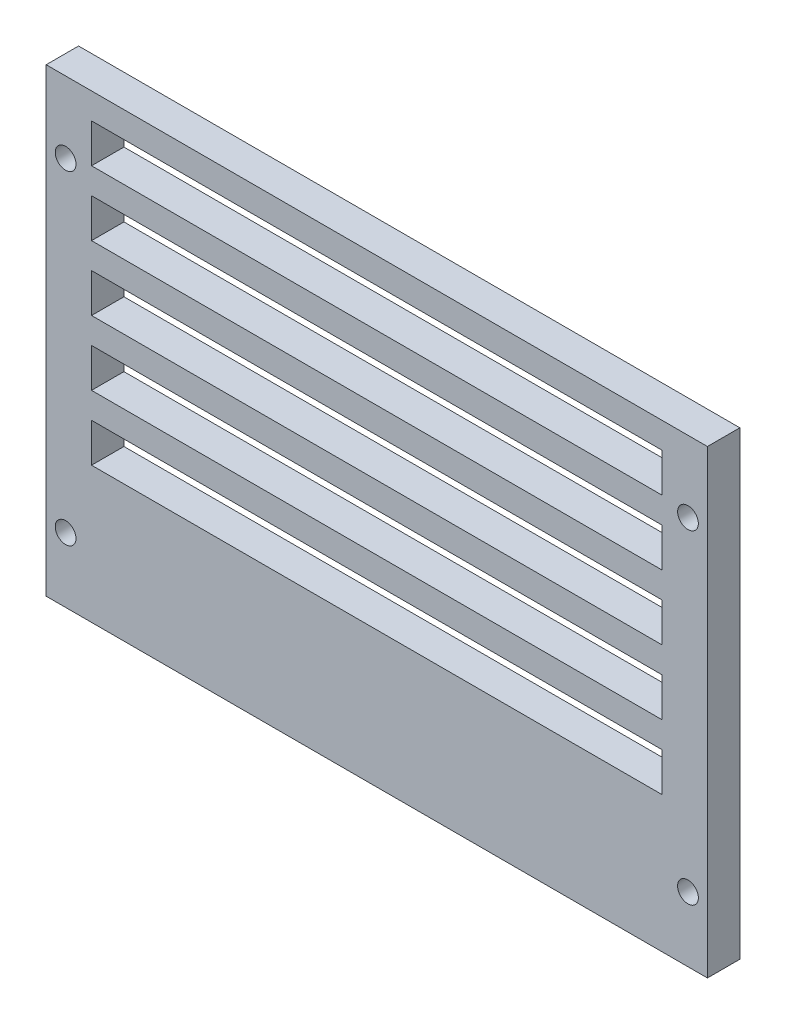
ISO-10303-21;
HEADER;
FILE_DESCRIPTION(('STEP AP214'),'2;1');
FILE_NAME('part.step','',(''),(''),'','','');
FILE_SCHEMA(('AUTOMOTIVE_DESIGN { 1 0 10303 214 1 1 1 1 }'));
ENDSEC;
DATA;
#1=APPLICATION_CONTEXT('core data for automotive mechanical design processes');
#2=APPLICATION_PROTOCOL_DEFINITION('international standard','automotive_design',2000,#1);
#3=PRODUCT_CONTEXT('',#1,'mechanical');
#4=PRODUCT('Part','Part','',(#3));
#5=PRODUCT_RELATED_PRODUCT_CATEGORY('part','',(#4));
#6=PRODUCT_DEFINITION_FORMATION('','',#4);
#7=PRODUCT_DEFINITION_CONTEXT('part definition',#1,'design');
#8=PRODUCT_DEFINITION('design','',#6,#7);
#9=PRODUCT_DEFINITION_SHAPE('','',#8);
#10=(LENGTH_UNIT() NAMED_UNIT(*) SI_UNIT(.MILLI.,.METRE.));
#11=(NAMED_UNIT(*) PLANE_ANGLE_UNIT() SI_UNIT($,.RADIAN.));
#12=(NAMED_UNIT(*) SI_UNIT($,.STERADIAN.) SOLID_ANGLE_UNIT());
#13=UNCERTAINTY_MEASURE_WITH_UNIT(LENGTH_MEASURE(1.E-05),#10,'distance_accuracy_value','');
#14=(GEOMETRIC_REPRESENTATION_CONTEXT(3) GLOBAL_UNCERTAINTY_ASSIGNED_CONTEXT((#13)) GLOBAL_UNIT_ASSIGNED_CONTEXT((#10,
#11,#12)) REPRESENTATION_CONTEXT('',''));
#15=CARTESIAN_POINT('',(0.,0.,0.));
#16=DIRECTION('',(0.,0.,1.));
#17=DIRECTION('',(1.,0.,0.));
#18=AXIS2_PLACEMENT_3D('',#15,#16,#17);
#19=CARTESIAN_POINT('',(7.,21.,0.));
#20=DIRECTION('',(0.,-1.,0.));
#21=DIRECTION('',(0.,0.,-1.));
#22=AXIS2_PLACEMENT_3D('',#19,#20,#21);
#23=PLANE('',#22);
#24=DIRECTION('',(1.,0.,0.));
#25=VECTOR('',#24,1.);
#26=CARTESIAN_POINT('',(7.,21.,5.));
#27=LINE('',#26,#25);
#28=CARTESIAN_POINT('',(7.,21.,5.));
#29=VERTEX_POINT('',#28);
#30=CARTESIAN_POINT('',(95.,21.,5.));
#31=VERTEX_POINT('',#30);
#32=EDGE_CURVE('E475',#29,#31,#27,.T.);
#33=ORIENTED_EDGE('',*,*,#32,.T.);
#34=DIRECTION('',(0.,0.,1.));
#35=VECTOR('',#34,1.);
#36=CARTESIAN_POINT('',(95.,21.,0.));
#37=LINE('',#36,#35);
#38=CARTESIAN_POINT('',(95.,21.,0.));
#39=VERTEX_POINT('',#38);
#40=EDGE_CURVE('E11',#39,#31,#37,.T.);
#41=ORIENTED_EDGE('',*,*,#40,.F.);
#42=DIRECTION('',(1.,0.,0.));
#43=VECTOR('',#42,1.);
#44=CARTESIAN_POINT('',(7.,21.,0.));
#45=LINE('',#44,#43);
#46=CARTESIAN_POINT('',(7.,21.,0.));
#47=VERTEX_POINT('',#46);
#48=EDGE_CURVE('E481',#47,#39,#45,.T.);
#49=ORIENTED_EDGE('',*,*,#48,.F.);
#50=DIRECTION('',(0.,0.,1.));
#51=VECTOR('',#50,1.);
#52=CARTESIAN_POINT('',(7.,21.,0.));
#53=LINE('',#52,#51);
#54=EDGE_CURVE('E489',#47,#29,#53,.T.);
#55=ORIENTED_EDGE('',*,*,#54,.T.);
#56=EDGE_LOOP('',(#33,#41,#49,#55));
#57=FACE_BOUND('',#56,.T.);
#58=ADVANCED_FACE('F41',(#57),#23,.F.);
#59=CARTESIAN_POINT('',(95.,27.,0.));
#60=DIRECTION('',(1.,0.,0.));
#61=DIRECTION('',(0.,0.,-1.));
#62=AXIS2_PLACEMENT_3D('',#59,#60,#61);
#63=PLANE('',#62);
#64=DIRECTION('',(0.,1.,0.));
#65=VECTOR('',#64,1.);
#66=CARTESIAN_POINT('',(95.,27.,5.));
#67=LINE('',#66,#65);
#68=CARTESIAN_POINT('',(95.,27.,5.));
#69=VERTEX_POINT('',#68);
#70=EDGE_CURVE('E471',#31,#69,#67,.T.);
#71=ORIENTED_EDGE('',*,*,#70,.T.);
#72=DIRECTION('',(0.,0.,1.));
#73=VECTOR('',#72,1.);
#74=CARTESIAN_POINT('',(95.,27.,0.));
#75=LINE('',#74,#73);
#76=CARTESIAN_POINT('',(95.,27.,0.));
#77=VERTEX_POINT('',#76);
#78=EDGE_CURVE('E49',#77,#69,#75,.T.);
#79=ORIENTED_EDGE('',*,*,#78,.F.);
#80=DIRECTION('',(0.,1.,0.));
#81=VECTOR('',#80,1.);
#82=CARTESIAN_POINT('',(95.,27.,0.));
#83=LINE('',#82,#81);
#84=EDGE_CURVE('E63',#39,#77,#83,.T.);
#85=ORIENTED_EDGE('',*,*,#84,.F.);
#86=ORIENTED_EDGE('',*,*,#40,.T.);
#87=EDGE_LOOP('',(#71,#79,#85,#86));
#88=FACE_BOUND('',#87,.T.);
#89=ADVANCED_FACE('F502',(#88),#63,.F.);
#90=CARTESIAN_POINT('',(7.,27.,0.));
#91=DIRECTION('',(0.,1.,0.));
#92=DIRECTION('',(0.,0.,1.));
#93=AXIS2_PLACEMENT_3D('',#90,#91,#92);
#94=PLANE('',#93);
#95=DIRECTION('',(-1.,0.,0.));
#96=VECTOR('',#95,1.);
#97=CARTESIAN_POINT('',(7.,27.,5.));
#98=LINE('',#97,#96);
#99=CARTESIAN_POINT('',(7.,27.,5.));
#100=VERTEX_POINT('',#99);
#101=EDGE_CURVE('E467',#69,#100,#98,.T.);
#102=ORIENTED_EDGE('',*,*,#101,.T.);
#103=DIRECTION('',(0.,0.,1.));
#104=VECTOR('',#103,1.);
#105=CARTESIAN_POINT('',(7.,27.,0.));
#106=LINE('',#105,#104);
#107=CARTESIAN_POINT('',(7.,27.,0.));
#108=VERTEX_POINT('',#107);
#109=EDGE_CURVE('E493',#108,#100,#106,.T.);
#110=ORIENTED_EDGE('',*,*,#109,.F.);
#111=DIRECTION('',(-1.,0.,0.));
#112=VECTOR('',#111,1.);
#113=CARTESIAN_POINT('',(7.,27.,0.));
#114=LINE('',#113,#112);
#115=EDGE_CURVE('E486',#77,#108,#114,.T.);
#116=ORIENTED_EDGE('',*,*,#115,.F.);
#117=ORIENTED_EDGE('',*,*,#78,.T.);
#118=EDGE_LOOP('',(#102,#110,#116,#117));
#119=FACE_BOUND('',#118,.T.);
#120=ADVANCED_FACE('F499',(#119),#94,.F.);
#121=CARTESIAN_POINT('',(7.,27.,0.));
#122=DIRECTION('',(-1.,0.,0.));
#123=DIRECTION('',(0.,0.,1.));
#124=AXIS2_PLACEMENT_3D('',#121,#122,#123);
#125=PLANE('',#124);
#126=DIRECTION('',(0.,-1.,0.));
#127=VECTOR('',#126,1.);
#128=CARTESIAN_POINT('',(7.,27.,5.));
#129=LINE('',#128,#127);
#130=EDGE_CURVE('E464',#100,#29,#129,.T.);
#131=ORIENTED_EDGE('',*,*,#130,.T.);
#132=ORIENTED_EDGE('',*,*,#54,.F.);
#133=DIRECTION('',(0.,-1.,0.));
#134=VECTOR('',#133,1.);
#135=CARTESIAN_POINT('',(7.,27.,0.));
#136=LINE('',#135,#134);
#137=EDGE_CURVE('E56',#108,#47,#136,.T.);
#138=ORIENTED_EDGE('',*,*,#137,.F.);
#139=ORIENTED_EDGE('',*,*,#109,.T.);
#140=EDGE_LOOP('',(#131,#132,#138,#139));
#141=FACE_BOUND('',#140,.T.);
#142=ADVANCED_FACE('F508',(#141),#125,.F.);
#143=CARTESIAN_POINT('',(7.,31.,0.));
#144=DIRECTION('',(0.,-1.,0.));
#145=DIRECTION('',(0.,0.,-1.));
#146=AXIS2_PLACEMENT_3D('',#143,#144,#145);
#147=PLANE('',#146);
#148=DIRECTION('',(1.,0.,0.));
#149=VECTOR('',#148,1.);
#150=CARTESIAN_POINT('',(7.,31.,5.));
#151=LINE('',#150,#149);
#152=CARTESIAN_POINT('',(7.,31.,5.));
#153=VERTEX_POINT('',#152);
#154=CARTESIAN_POINT('',(95.,31.,5.));
#155=VERTEX_POINT('',#154);
#156=EDGE_CURVE('E431',#153,#155,#151,.T.);
#157=ORIENTED_EDGE('',*,*,#156,.T.);
#158=DIRECTION('',(0.,0.,1.));
#159=VECTOR('',#158,1.);
#160=CARTESIAN_POINT('',(95.,31.,0.));
#161=LINE('',#160,#159);
#162=CARTESIAN_POINT('',(95.,31.,0.));
#163=VERTEX_POINT('',#162);
#164=EDGE_CURVE('E460',#163,#155,#161,.T.);
#165=ORIENTED_EDGE('',*,*,#164,.F.);
#166=DIRECTION('',(1.,0.,0.));
#167=VECTOR('',#166,1.);
#168=CARTESIAN_POINT('',(7.,31.,0.));
#169=LINE('',#168,#167);
#170=CARTESIAN_POINT('',(7.,31.,0.));
#171=VERTEX_POINT('',#170);
#172=EDGE_CURVE('E438',#171,#163,#169,.T.);
#173=ORIENTED_EDGE('',*,*,#172,.F.);
#174=DIRECTION('',(0.,0.,1.));
#175=VECTOR('',#174,1.);
#176=CARTESIAN_POINT('',(7.,31.,0.));
#177=LINE('',#176,#175);
#178=EDGE_CURVE('E448',#171,#153,#177,.T.);
#179=ORIENTED_EDGE('',*,*,#178,.T.);
#180=EDGE_LOOP('',(#157,#165,#173,#179));
#181=FACE_BOUND('',#180,.T.);
#182=ADVANCED_FACE('F510',(#181),#147,.F.);
#183=CARTESIAN_POINT('',(95.,37.,0.));
#184=DIRECTION('',(1.,0.,0.));
#185=DIRECTION('',(0.,0.,-1.));
#186=AXIS2_PLACEMENT_3D('',#183,#184,#185);
#187=PLANE('',#186);
#188=DIRECTION('',(0.,1.,0.));
#189=VECTOR('',#188,1.);
#190=CARTESIAN_POINT('',(95.,37.,5.));
#191=LINE('',#190,#189);
#192=CARTESIAN_POINT('',(95.,37.,5.));
#193=VERTEX_POINT('',#192);
#194=EDGE_CURVE('E427',#155,#193,#191,.T.);
#195=ORIENTED_EDGE('',*,*,#194,.T.);
#196=DIRECTION('',(0.,0.,1.));
#197=VECTOR('',#196,1.);
#198=CARTESIAN_POINT('',(95.,37.,0.));
#199=LINE('',#198,#197);
#200=CARTESIAN_POINT('',(95.,37.,0.));
#201=VERTEX_POINT('',#200);
#202=EDGE_CURVE('E456',#201,#193,#199,.T.);
#203=ORIENTED_EDGE('',*,*,#202,.F.);
#204=DIRECTION('',(0.,1.,0.));
#205=VECTOR('',#204,1.);
#206=CARTESIAN_POINT('',(95.,37.,0.));
#207=LINE('',#206,#205);
#208=EDGE_CURVE('E441',#163,#201,#207,.T.);
#209=ORIENTED_EDGE('',*,*,#208,.F.);
#210=ORIENTED_EDGE('',*,*,#164,.T.);
#211=EDGE_LOOP('',(#195,#203,#209,#210));
#212=FACE_BOUND('',#211,.T.);
#213=ADVANCED_FACE('F516',(#212),#187,.F.);
#214=CARTESIAN_POINT('',(7.,37.,0.));
#215=DIRECTION('',(0.,1.,0.));
#216=DIRECTION('',(0.,0.,1.));
#217=AXIS2_PLACEMENT_3D('',#214,#215,#216);
#218=PLANE('',#217);
#219=DIRECTION('',(-1.,0.,0.));
#220=VECTOR('',#219,1.);
#221=CARTESIAN_POINT('',(7.,37.,5.));
#222=LINE('',#221,#220);
#223=CARTESIAN_POINT('',(7.,37.,5.));
#224=VERTEX_POINT('',#223);
#225=EDGE_CURVE('E423',#193,#224,#222,.T.);
#226=ORIENTED_EDGE('',*,*,#225,.T.);
#227=DIRECTION('',(0.,0.,1.));
#228=VECTOR('',#227,1.);
#229=CARTESIAN_POINT('',(7.,37.,0.));
#230=LINE('',#229,#228);
#231=CARTESIAN_POINT('',(7.,37.,0.));
#232=VERTEX_POINT('',#231);
#233=EDGE_CURVE('E452',#232,#224,#230,.T.);
#234=ORIENTED_EDGE('',*,*,#233,.F.);
#235=DIRECTION('',(-1.,0.,0.));
#236=VECTOR('',#235,1.);
#237=CARTESIAN_POINT('',(7.,37.,0.));
#238=LINE('',#237,#236);
#239=EDGE_CURVE('E444',#201,#232,#238,.T.);
#240=ORIENTED_EDGE('',*,*,#239,.F.);
#241=ORIENTED_EDGE('',*,*,#202,.T.);
#242=EDGE_LOOP('',(#226,#234,#240,#241));
#243=FACE_BOUND('',#242,.T.);
#244=ADVANCED_FACE('F549',(#243),#218,.F.);
#245=CARTESIAN_POINT('',(7.,37.,0.));
#246=DIRECTION('',(-1.,0.,0.));
#247=DIRECTION('',(0.,0.,1.));
#248=AXIS2_PLACEMENT_3D('',#245,#246,#247);
#249=PLANE('',#248);
#250=DIRECTION('',(0.,-1.,0.));
#251=VECTOR('',#250,1.);
#252=CARTESIAN_POINT('',(7.,37.,5.));
#253=LINE('',#252,#251);
#254=EDGE_CURVE('E420',#224,#153,#253,.T.);
#255=ORIENTED_EDGE('',*,*,#254,.T.);
#256=ORIENTED_EDGE('',*,*,#178,.F.);
#257=DIRECTION('',(0.,-1.,0.));
#258=VECTOR('',#257,1.);
#259=CARTESIAN_POINT('',(7.,37.,0.));
#260=LINE('',#259,#258);
#261=EDGE_CURVE('E435',#232,#171,#260,.T.);
#262=ORIENTED_EDGE('',*,*,#261,.F.);
#263=ORIENTED_EDGE('',*,*,#233,.T.);
#264=EDGE_LOOP('',(#255,#256,#262,#263));
#265=FACE_BOUND('',#264,.T.);
#266=ADVANCED_FACE('F559',(#265),#249,.F.);
#267=CARTESIAN_POINT('',(7.,41.,0.));
#268=DIRECTION('',(0.,-1.,0.));
#269=DIRECTION('',(0.,0.,-1.));
#270=AXIS2_PLACEMENT_3D('',#267,#268,#269);
#271=PLANE('',#270);
#272=DIRECTION('',(1.,0.,0.));
#273=VECTOR('',#272,1.);
#274=CARTESIAN_POINT('',(7.,41.,5.));
#275=LINE('',#274,#273);
#276=CARTESIAN_POINT('',(7.,41.,5.));
#277=VERTEX_POINT('',#276);
#278=CARTESIAN_POINT('',(95.,41.,5.));
#279=VERTEX_POINT('',#278);
#280=EDGE_CURVE('E387',#277,#279,#275,.T.);
#281=ORIENTED_EDGE('',*,*,#280,.T.);
#282=DIRECTION('',(0.,0.,1.));
#283=VECTOR('',#282,1.);
#284=CARTESIAN_POINT('',(95.,41.,0.));
#285=LINE('',#284,#283);
#286=CARTESIAN_POINT('',(95.,41.,0.));
#287=VERTEX_POINT('',#286);
#288=EDGE_CURVE('E416',#287,#279,#285,.T.);
#289=ORIENTED_EDGE('',*,*,#288,.F.);
#290=DIRECTION('',(1.,0.,0.));
#291=VECTOR('',#290,1.);
#292=CARTESIAN_POINT('',(7.,41.,0.));
#293=LINE('',#292,#291);
#294=CARTESIAN_POINT('',(7.,41.,0.));
#295=VERTEX_POINT('',#294);
#296=EDGE_CURVE('E394',#295,#287,#293,.T.);
#297=ORIENTED_EDGE('',*,*,#296,.F.);
#298=DIRECTION('',(0.,0.,1.));
#299=VECTOR('',#298,1.);
#300=CARTESIAN_POINT('',(7.,41.,0.));
#301=LINE('',#300,#299);
#302=EDGE_CURVE('E404',#295,#277,#301,.T.);
#303=ORIENTED_EDGE('',*,*,#302,.T.);
#304=EDGE_LOOP('',(#281,#289,#297,#303));
#305=FACE_BOUND('',#304,.T.);
#306=ADVANCED_FACE('F569',(#305),#271,.F.);
#307=CARTESIAN_POINT('',(95.,47.,0.));
#308=DIRECTION('',(1.,0.,0.));
#309=DIRECTION('',(0.,0.,-1.));
#310=AXIS2_PLACEMENT_3D('',#307,#308,#309);
#311=PLANE('',#310);
#312=DIRECTION('',(0.,1.,0.));
#313=VECTOR('',#312,1.);
#314=CARTESIAN_POINT('',(95.,47.,5.));
#315=LINE('',#314,#313);
#316=CARTESIAN_POINT('',(95.,47.,5.));
#317=VERTEX_POINT('',#316);
#318=EDGE_CURVE('E383',#279,#317,#315,.T.);
#319=ORIENTED_EDGE('',*,*,#318,.T.);
#320=DIRECTION('',(0.,0.,1.));
#321=VECTOR('',#320,1.);
#322=CARTESIAN_POINT('',(95.,47.,0.));
#323=LINE('',#322,#321);
#324=CARTESIAN_POINT('',(95.,47.,0.));
#325=VERTEX_POINT('',#324);
#326=EDGE_CURVE('E412',#325,#317,#323,.T.);
#327=ORIENTED_EDGE('',*,*,#326,.F.);
#328=DIRECTION('',(0.,1.,0.));
#329=VECTOR('',#328,1.);
#330=CARTESIAN_POINT('',(95.,47.,0.));
#331=LINE('',#330,#329);
#332=EDGE_CURVE('E397',#287,#325,#331,.T.);
#333=ORIENTED_EDGE('',*,*,#332,.F.);
#334=ORIENTED_EDGE('',*,*,#288,.T.);
#335=EDGE_LOOP('',(#319,#327,#333,#334));
#336=FACE_BOUND('',#335,.T.);
#337=ADVANCED_FACE('F579',(#336),#311,.F.);
#338=CARTESIAN_POINT('',(7.,47.,0.));
#339=DIRECTION('',(0.,1.,0.));
#340=DIRECTION('',(0.,0.,1.));
#341=AXIS2_PLACEMENT_3D('',#338,#339,#340);
#342=PLANE('',#341);
#343=DIRECTION('',(-1.,0.,0.));
#344=VECTOR('',#343,1.);
#345=CARTESIAN_POINT('',(7.,47.,5.));
#346=LINE('',#345,#344);
#347=CARTESIAN_POINT('',(7.,47.,5.));
#348=VERTEX_POINT('',#347);
#349=EDGE_CURVE('E379',#317,#348,#346,.T.);
#350=ORIENTED_EDGE('',*,*,#349,.T.);
#351=DIRECTION('',(0.,0.,1.));
#352=VECTOR('',#351,1.);
#353=CARTESIAN_POINT('',(7.,47.,0.));
#354=LINE('',#353,#352);
#355=CARTESIAN_POINT('',(7.,47.,0.));
#356=VERTEX_POINT('',#355);
#357=EDGE_CURVE('E408',#356,#348,#354,.T.);
#358=ORIENTED_EDGE('',*,*,#357,.F.);
#359=DIRECTION('',(-1.,0.,0.));
#360=VECTOR('',#359,1.);
#361=CARTESIAN_POINT('',(7.,47.,0.));
#362=LINE('',#361,#360);
#363=EDGE_CURVE('E400',#325,#356,#362,.T.);
#364=ORIENTED_EDGE('',*,*,#363,.F.);
#365=ORIENTED_EDGE('',*,*,#326,.T.);
#366=EDGE_LOOP('',(#350,#358,#364,#365));
#367=FACE_BOUND('',#366,.T.);
#368=ADVANCED_FACE('F589',(#367),#342,.F.);
#369=CARTESIAN_POINT('',(7.,47.,0.));
#370=DIRECTION('',(-1.,0.,0.));
#371=DIRECTION('',(0.,0.,1.));
#372=AXIS2_PLACEMENT_3D('',#369,#370,#371);
#373=PLANE('',#372);
#374=DIRECTION('',(0.,-1.,0.));
#375=VECTOR('',#374,1.);
#376=CARTESIAN_POINT('',(7.,47.,5.));
#377=LINE('',#376,#375);
#378=EDGE_CURVE('E376',#348,#277,#377,.T.);
#379=ORIENTED_EDGE('',*,*,#378,.T.);
#380=ORIENTED_EDGE('',*,*,#302,.F.);
#381=DIRECTION('',(0.,-1.,0.));
#382=VECTOR('',#381,1.);
#383=CARTESIAN_POINT('',(7.,47.,0.));
#384=LINE('',#383,#382);
#385=EDGE_CURVE('E391',#356,#295,#384,.T.);
#386=ORIENTED_EDGE('',*,*,#385,.F.);
#387=ORIENTED_EDGE('',*,*,#357,.T.);
#388=EDGE_LOOP('',(#379,#380,#386,#387));
#389=FACE_BOUND('',#388,.T.);
#390=ADVANCED_FACE('F599',(#389),#373,.F.);
#391=CARTESIAN_POINT('',(0.,0.,5.));
#392=DIRECTION('',(1.,0.,0.));
#393=DIRECTION('',(0.,0.,-1.));
#394=AXIS2_PLACEMENT_3D('',#391,#392,#393);
#395=PLANE('',#394);
#396=DIRECTION('',(0.,-1.,0.));
#397=VECTOR('',#396,1.);
#398=CARTESIAN_POINT('',(0.,0.,0.));
#399=LINE('',#398,#397);
#400=CARTESIAN_POINT('',(0.,71.,0.));
#401=VERTEX_POINT('',#400);
#402=CARTESIAN_POINT('',(0.,0.,0.));
#403=VERTEX_POINT('',#402);
#404=EDGE_CURVE('E345',#401,#403,#399,.T.);
#405=ORIENTED_EDGE('',*,*,#404,.T.);
#406=DIRECTION('',(0.,0.,-1.));
#407=VECTOR('',#406,1.);
#408=CARTESIAN_POINT('',(0.,0.,5.));
#409=LINE('',#408,#407);
#410=CARTESIAN_POINT('',(0.,0.,5.));
#411=VERTEX_POINT('',#410);
#412=EDGE_CURVE('E372',#411,#403,#409,.T.);
#413=ORIENTED_EDGE('',*,*,#412,.F.);
#414=DIRECTION('',(0.,-1.,0.));
#415=VECTOR('',#414,1.);
#416=CARTESIAN_POINT('',(0.,0.,5.));
#417=LINE('',#416,#415);
#418=CARTESIAN_POINT('',(0.,71.,5.));
#419=VERTEX_POINT('',#418);
#420=EDGE_CURVE('E349',#419,#411,#417,.T.);
#421=ORIENTED_EDGE('',*,*,#420,.F.);
#422=DIRECTION('',(0.,0.,1.));
#423=VECTOR('',#422,1.);
#424=CARTESIAN_POINT('',(0.,71.,0.));
#425=LINE('',#424,#423);
#426=EDGE_CURVE('E309',#401,#419,#425,.T.);
#427=ORIENTED_EDGE('',*,*,#426,.F.);
#428=EDGE_LOOP('',(#405,#413,#421,#427));
#429=FACE_BOUND('',#428,.T.);
#430=ADVANCED_FACE('F609',(#429),#395,.F.);
#431=CARTESIAN_POINT('',(0.,0.,5.));
#432=DIRECTION('',(0.,1.,0.));
#433=DIRECTION('',(0.,0.,1.));
#434=AXIS2_PLACEMENT_3D('',#431,#432,#433);
#435=PLANE('',#434);
#436=DIRECTION('',(1.,0.,0.));
#437=VECTOR('',#436,1.);
#438=CARTESIAN_POINT('',(0.,0.,0.));
#439=LINE('',#438,#437);
#440=CARTESIAN_POINT('',(102.,0.,0.));
#441=VERTEX_POINT('',#440);
#442=EDGE_CURVE('E364',#403,#441,#439,.T.);
#443=ORIENTED_EDGE('',*,*,#442,.T.);
#444=DIRECTION('',(0.,0.,-1.));
#445=VECTOR('',#444,1.);
#446=CARTESIAN_POINT('',(102.,0.,5.));
#447=LINE('',#446,#445);
#448=CARTESIAN_POINT('',(102.,0.,5.));
#449=VERTEX_POINT('',#448);
#450=EDGE_CURVE('E360',#449,#441,#447,.T.);
#451=ORIENTED_EDGE('',*,*,#450,.F.);
#452=DIRECTION('',(1.,0.,0.));
#453=VECTOR('',#452,1.);
#454=CARTESIAN_POINT('',(0.,0.,5.));
#455=LINE('',#454,#453);
#456=EDGE_CURVE('E353',#411,#449,#455,.T.);
#457=ORIENTED_EDGE('',*,*,#456,.F.);
#458=ORIENTED_EDGE('',*,*,#412,.T.);
#459=EDGE_LOOP('',(#443,#451,#457,#458));
#460=FACE_BOUND('',#459,.T.);
#461=ADVANCED_FACE('F713',(#460),#435,.F.);
#462=CARTESIAN_POINT('',(102.,0.,5.));
#463=DIRECTION('',(-1.,0.,0.));
#464=DIRECTION('',(0.,0.,1.));
#465=AXIS2_PLACEMENT_3D('',#462,#463,#464);
#466=PLANE('',#465);
#467=DIRECTION('',(0.,1.,0.));
#468=VECTOR('',#467,1.);
#469=CARTESIAN_POINT('',(102.,0.,0.));
#470=LINE('',#469,#468);
#471=CARTESIAN_POINT('',(102.,71.,0.));
#472=VERTEX_POINT('',#471);
#473=EDGE_CURVE('E354',#441,#472,#470,.T.);
#474=ORIENTED_EDGE('',*,*,#473,.T.);
#475=DIRECTION('',(0.,0.,1.));
#476=VECTOR('',#475,1.);
#477=CARTESIAN_POINT('',(102.,71.,0.));
#478=LINE('',#477,#476);
#479=CARTESIAN_POINT('',(102.,71.,5.));
#480=VERTEX_POINT('',#479);
#481=EDGE_CURVE('E305',#472,#480,#478,.T.);
#482=ORIENTED_EDGE('',*,*,#481,.T.);
#483=DIRECTION('',(0.,1.,0.));
#484=VECTOR('',#483,1.);
#485=CARTESIAN_POINT('',(102.,0.,5.));
#486=LINE('',#485,#484);
#487=EDGE_CURVE('E357',#449,#480,#486,.T.);
#488=ORIENTED_EDGE('',*,*,#487,.F.);
#489=ORIENTED_EDGE('',*,*,#450,.T.);
#490=EDGE_LOOP('',(#474,#482,#488,#489));
#491=FACE_BOUND('',#490,.T.);
#492=ADVANCED_FACE('F623',(#491),#466,.F.);
#493=CARTESIAN_POINT('',(0.,0.,5.));
#494=DIRECTION('',(0.,0.,-1.));
#495=DIRECTION('',(-1.,0.,0.));
#496=AXIS2_PLACEMENT_3D('',#493,#494,#495);
#497=PLANE('',#496);
#498=DIRECTION('',(1.,0.,0.));
#499=VECTOR('',#498,1.);
#500=CARTESIAN_POINT('',(7.,51.,5.));
#501=LINE('',#500,#499);
#502=CARTESIAN_POINT('',(7.,51.,5.));
#503=VERTEX_POINT('',#502);
#504=CARTESIAN_POINT('',(95.,51.,5.));
#505=VERTEX_POINT('',#504);
#506=EDGE_CURVE('E204',#503,#505,#501,.T.);
#507=ORIENTED_EDGE('',*,*,#506,.F.);
#508=DIRECTION('',(0.,-1.,0.));
#509=VECTOR('',#508,1.);
#510=CARTESIAN_POINT('',(7.,57.,5.));
#511=LINE('',#510,#509);
#512=CARTESIAN_POINT('',(7.,57.,5.));
#513=VERTEX_POINT('',#512);
#514=EDGE_CURVE('E249',#513,#503,#511,.T.);
#515=ORIENTED_EDGE('',*,*,#514,.F.);
#516=DIRECTION('',(-1.,0.,0.));
#517=VECTOR('',#516,1.);
#518=CARTESIAN_POINT('',(7.,57.,5.));
#519=LINE('',#518,#517);
#520=CARTESIAN_POINT('',(95.,57.,5.));
#521=VERTEX_POINT('',#520);
#522=EDGE_CURVE('E228',#521,#513,#519,.T.);
#523=ORIENTED_EDGE('',*,*,#522,.F.);
#524=DIRECTION('',(0.,1.,0.));
#525=VECTOR('',#524,1.);
#526=CARTESIAN_POINT('',(95.,57.,5.));
#527=LINE('',#526,#525);
#528=EDGE_CURVE('E219',#505,#521,#527,.T.);
#529=ORIENTED_EDGE('',*,*,#528,.F.);
#530=EDGE_LOOP('',(#507,#515,#523,#529));
#531=FACE_BOUND('',#530,.T.);
#532=DIRECTION('',(1.,0.,0.));
#533=VECTOR('',#532,1.);
#534=CARTESIAN_POINT('',(7.,61.,5.));
#535=LINE('',#534,#533);
#536=CARTESIAN_POINT('',(7.,61.,5.));
#537=VERTEX_POINT('',#536);
#538=CARTESIAN_POINT('',(95.,61.,5.));
#539=VERTEX_POINT('',#538);
#540=EDGE_CURVE('E277',#537,#539,#535,.T.);
#541=ORIENTED_EDGE('',*,*,#540,.F.);
#542=DIRECTION('',(0.,-1.,0.));
#543=VECTOR('',#542,1.);
#544=CARTESIAN_POINT('',(7.,67.,5.));
#545=LINE('',#544,#543);
#546=CARTESIAN_POINT('',(7.,67.,5.));
#547=VERTEX_POINT('',#546);
#548=EDGE_CURVE('E256',#547,#537,#545,.T.);
#549=ORIENTED_EDGE('',*,*,#548,.F.);
#550=DIRECTION('',(-1.,0.,0.));
#551=VECTOR('',#550,1.);
#552=CARTESIAN_POINT('',(7.,67.,5.));
#553=LINE('',#552,#551);
#554=CARTESIAN_POINT('',(95.,67.,5.));
#555=VERTEX_POINT('',#554);
#556=EDGE_CURVE('E262',#555,#547,#553,.T.);
#557=ORIENTED_EDGE('',*,*,#556,.F.);
#558=DIRECTION('',(0.,1.,0.));
#559=VECTOR('',#558,1.);
#560=CARTESIAN_POINT('',(95.,67.,5.));
#561=LINE('',#560,#559);
#562=EDGE_CURVE('E281',#539,#555,#561,.T.);
#563=ORIENTED_EDGE('',*,*,#562,.F.);
#564=EDGE_LOOP('',(#541,#549,#557,#563));
#565=FACE_BOUND('',#564,.T.);
#566=CARTESIAN_POINT('',(99.,60.,5.));
#567=DIRECTION('',(0.,0.,1.));
#568=DIRECTION('',(1.,0.,0.));
#569=AXIS2_PLACEMENT_3D('',#566,#567,#568);
#570=CIRCLE('',#569,1.60000000000001);
#571=CARTESIAN_POINT('',(100.6,60.,5.));
#572=VERTEX_POINT('',#571);
#573=EDGE_CURVE('E313',#572,#572,#570,.T.);
#574=ORIENTED_EDGE('',*,*,#573,.F.);
#575=EDGE_LOOP('',(#574));
#576=FACE_BOUND('',#575,.T.);
#577=CARTESIAN_POINT('',(3.,10.,5.));
#578=DIRECTION('',(0.,0.,1.));
#579=DIRECTION('',(1.,0.,0.));
#580=AXIS2_PLACEMENT_3D('',#577,#578,#579);
#581=CIRCLE('',#580,1.6);
#582=CARTESIAN_POINT('',(4.6,10.,5.));
#583=VERTEX_POINT('',#582);
#584=EDGE_CURVE('E330',#583,#583,#581,.T.);
#585=ORIENTED_EDGE('',*,*,#584,.F.);
#586=EDGE_LOOP('',(#585));
#587=FACE_BOUND('',#586,.T.);
#588=CARTESIAN_POINT('',(99.,10.,5.));
#589=DIRECTION('',(0.,0.,1.));
#590=DIRECTION('',(1.,0.,0.));
#591=AXIS2_PLACEMENT_3D('',#588,#589,#590);
#592=CIRCLE('',#591,1.6);
#593=CARTESIAN_POINT('',(100.6,10.,5.));
#594=VERTEX_POINT('',#593);
#595=EDGE_CURVE('E322',#594,#594,#592,.T.);
#596=ORIENTED_EDGE('',*,*,#595,.F.);
#597=EDGE_LOOP('',(#596));
#598=FACE_BOUND('',#597,.T.);
#599=CARTESIAN_POINT('',(3.,60.,5.));
#600=DIRECTION('',(0.,0.,1.));
#601=DIRECTION('',(1.,0.,0.));
#602=AXIS2_PLACEMENT_3D('',#599,#600,#601);
#603=CIRCLE('',#602,1.6);
#604=CARTESIAN_POINT('',(4.6,60.,5.));
#605=VERTEX_POINT('',#604);
#606=EDGE_CURVE('E321',#605,#605,#603,.T.);
#607=ORIENTED_EDGE('',*,*,#606,.F.);
#608=EDGE_LOOP('',(#607));
#609=FACE_BOUND('',#608,.T.);
#610=ORIENTED_EDGE('',*,*,#420,.T.);
#611=ORIENTED_EDGE('',*,*,#456,.T.);
#612=ORIENTED_EDGE('',*,*,#487,.T.);
#613=DIRECTION('',(-1.,0.,0.));
#614=VECTOR('',#613,1.);
#615=CARTESIAN_POINT('',(0.,71.,5.));
#616=LINE('',#615,#614);
#617=EDGE_CURVE('E291',#480,#419,#616,.T.);
#618=ORIENTED_EDGE('',*,*,#617,.T.);
#619=EDGE_LOOP('',(#610,#611,#612,#618));
#620=FACE_BOUND('',#619,.T.);
#621=ORIENTED_EDGE('',*,*,#378,.F.);
#622=ORIENTED_EDGE('',*,*,#349,.F.);
#623=ORIENTED_EDGE('',*,*,#318,.F.);
#624=ORIENTED_EDGE('',*,*,#280,.F.);
#625=EDGE_LOOP('',(#621,#622,#623,#624));
#626=FACE_BOUND('',#625,.T.);
#627=ORIENTED_EDGE('',*,*,#254,.F.);
#628=ORIENTED_EDGE('',*,*,#225,.F.);
#629=ORIENTED_EDGE('',*,*,#194,.F.);
#630=ORIENTED_EDGE('',*,*,#156,.F.);
#631=EDGE_LOOP('',(#627,#628,#629,#630));
#632=FACE_BOUND('',#631,.T.);
#633=ORIENTED_EDGE('',*,*,#130,.F.);
#634=ORIENTED_EDGE('',*,*,#101,.F.);
#635=ORIENTED_EDGE('',*,*,#70,.F.);
#636=ORIENTED_EDGE('',*,*,#32,.F.);
#637=EDGE_LOOP('',(#633,#634,#635,#636));
#638=FACE_BOUND('',#637,.T.);
#639=ADVANCED_FACE('F226',(#531,#565,#576,#587,#598,#609,#620,#626,#632,#638),#497,.F.);
#640=CARTESIAN_POINT('',(0.,0.,0.));
#641=DIRECTION('',(0.,0.,-1.));
#642=DIRECTION('',(-1.,0.,0.));
#643=AXIS2_PLACEMENT_3D('',#640,#641,#642);
#644=PLANE('',#643);
#645=DIRECTION('',(0.,-1.,0.));
#646=VECTOR('',#645,1.);
#647=CARTESIAN_POINT('',(7.,57.,0.));
#648=LINE('',#647,#646);
#649=CARTESIAN_POINT('',(7.,57.,0.));
#650=VERTEX_POINT('',#649);
#651=CARTESIAN_POINT('',(7.,51.,0.));
#652=VERTEX_POINT('',#651);
#653=EDGE_CURVE('E252',#650,#652,#648,.T.);
#654=ORIENTED_EDGE('',*,*,#653,.T.);
#655=DIRECTION('',(1.,0.,0.));
#656=VECTOR('',#655,1.);
#657=CARTESIAN_POINT('',(7.,51.,0.));
#658=LINE('',#657,#656);
#659=CARTESIAN_POINT('',(95.,51.,0.));
#660=VERTEX_POINT('',#659);
#661=EDGE_CURVE('E215',#652,#660,#658,.T.);
#662=ORIENTED_EDGE('',*,*,#661,.T.);
#663=DIRECTION('',(0.,1.,0.));
#664=VECTOR('',#663,1.);
#665=CARTESIAN_POINT('',(95.,57.,0.));
#666=LINE('',#665,#664);
#667=CARTESIAN_POINT('',(95.,57.,0.));
#668=VERTEX_POINT('',#667);
#669=EDGE_CURVE('E222',#660,#668,#666,.T.);
#670=ORIENTED_EDGE('',*,*,#669,.T.);
#671=DIRECTION('',(-1.,0.,0.));
#672=VECTOR('',#671,1.);
#673=CARTESIAN_POINT('',(7.,57.,0.));
#674=LINE('',#673,#672);
#675=EDGE_CURVE('E245',#668,#650,#674,.T.);
#676=ORIENTED_EDGE('',*,*,#675,.T.);
#677=EDGE_LOOP('',(#654,#662,#670,#676));
#678=FACE_BOUND('',#677,.T.);
#679=DIRECTION('',(0.,-1.,0.));
#680=VECTOR('',#679,1.);
#681=CARTESIAN_POINT('',(7.,67.,0.));
#682=LINE('',#681,#680);
#683=CARTESIAN_POINT('',(7.,67.,0.));
#684=VERTEX_POINT('',#683);
#685=CARTESIAN_POINT('',(7.,61.,0.));
#686=VERTEX_POINT('',#685);
#687=EDGE_CURVE('E257',#684,#686,#682,.T.);
#688=ORIENTED_EDGE('',*,*,#687,.T.);
#689=DIRECTION('',(1.,0.,0.));
#690=VECTOR('',#689,1.);
#691=CARTESIAN_POINT('',(7.,61.,0.));
#692=LINE('',#691,#690);
#693=CARTESIAN_POINT('',(95.,61.,0.));
#694=VERTEX_POINT('',#693);
#695=EDGE_CURVE('E261',#686,#694,#692,.T.);
#696=ORIENTED_EDGE('',*,*,#695,.T.);
#697=DIRECTION('',(0.,1.,0.));
#698=VECTOR('',#697,1.);
#699=CARTESIAN_POINT('',(95.,67.,0.));
#700=LINE('',#699,#698);
#701=CARTESIAN_POINT('',(95.,67.,0.));
#702=VERTEX_POINT('',#701);
#703=EDGE_CURVE('E266',#694,#702,#700,.T.);
#704=ORIENTED_EDGE('',*,*,#703,.T.);
#705=DIRECTION('',(-1.,0.,0.));
#706=VECTOR('',#705,1.);
#707=CARTESIAN_POINT('',(7.,67.,0.));
#708=LINE('',#707,#706);
#709=EDGE_CURVE('E270',#702,#684,#708,.T.);
#710=ORIENTED_EDGE('',*,*,#709,.T.);
#711=EDGE_LOOP('',(#688,#696,#704,#710));
#712=FACE_BOUND('',#711,.T.);
#713=CARTESIAN_POINT('',(99.,60.,0.));
#714=DIRECTION('',(0.,0.,1.));
#715=DIRECTION('',(1.,0.,0.));
#716=AXIS2_PLACEMENT_3D('',#713,#714,#715);
#717=CIRCLE('',#716,1.60000000000001);
#718=CARTESIAN_POINT('',(100.6,60.,0.));
#719=VERTEX_POINT('',#718);
#720=EDGE_CURVE('E334',#719,#719,#717,.T.);
#721=ORIENTED_EDGE('',*,*,#720,.T.);
#722=EDGE_LOOP('',(#721));
#723=FACE_BOUND('',#722,.T.);
#724=CARTESIAN_POINT('',(3.,10.,0.));
#725=DIRECTION('',(0.,0.,1.));
#726=DIRECTION('',(1.,0.,0.));
#727=AXIS2_PLACEMENT_3D('',#724,#725,#726);
#728=CIRCLE('',#727,1.6);
#729=CARTESIAN_POINT('',(4.6,10.,0.));
#730=VERTEX_POINT('',#729);
#731=EDGE_CURVE('E326',#730,#730,#728,.T.);
#732=ORIENTED_EDGE('',*,*,#731,.T.);
#733=EDGE_LOOP('',(#732));
#734=FACE_BOUND('',#733,.T.);
#735=CARTESIAN_POINT('',(99.,10.,0.));
#736=DIRECTION('',(0.,0.,1.));
#737=DIRECTION('',(1.,0.,0.));
#738=AXIS2_PLACEMENT_3D('',#735,#736,#737);
#739=CIRCLE('',#738,1.6);
#740=CARTESIAN_POINT('',(100.6,10.,0.));
#741=VERTEX_POINT('',#740);
#742=EDGE_CURVE('E317',#741,#741,#739,.T.);
#743=ORIENTED_EDGE('',*,*,#742,.T.);
#744=EDGE_LOOP('',(#743));
#745=FACE_BOUND('',#744,.T.);
#746=CARTESIAN_POINT('',(3.,60.,0.));
#747=DIRECTION('',(0.,0.,1.));
#748=DIRECTION('',(1.,0.,0.));
#749=AXIS2_PLACEMENT_3D('',#746,#747,#748);
#750=CIRCLE('',#749,1.6);
#751=CARTESIAN_POINT('',(4.6,60.,0.));
#752=VERTEX_POINT('',#751);
#753=EDGE_CURVE('E341',#752,#752,#750,.T.);
#754=ORIENTED_EDGE('',*,*,#753,.T.);
#755=EDGE_LOOP('',(#754));
#756=FACE_BOUND('',#755,.T.);
#757=ORIENTED_EDGE('',*,*,#404,.F.);
#758=DIRECTION('',(-1.,0.,0.));
#759=VECTOR('',#758,1.);
#760=CARTESIAN_POINT('',(0.,71.,0.));
#761=LINE('',#760,#759);
#762=EDGE_CURVE('E301',#472,#401,#761,.T.);
#763=ORIENTED_EDGE('',*,*,#762,.F.);
#764=ORIENTED_EDGE('',*,*,#473,.F.);
#765=ORIENTED_EDGE('',*,*,#442,.F.);
#766=EDGE_LOOP('',(#757,#763,#764,#765));
#767=FACE_BOUND('',#766,.T.);
#768=ORIENTED_EDGE('',*,*,#385,.T.);
#769=ORIENTED_EDGE('',*,*,#296,.T.);
#770=ORIENTED_EDGE('',*,*,#332,.T.);
#771=ORIENTED_EDGE('',*,*,#363,.T.);
#772=EDGE_LOOP('',(#768,#769,#770,#771));
#773=FACE_BOUND('',#772,.T.);
#774=ORIENTED_EDGE('',*,*,#261,.T.);
#775=ORIENTED_EDGE('',*,*,#172,.T.);
#776=ORIENTED_EDGE('',*,*,#208,.T.);
#777=ORIENTED_EDGE('',*,*,#239,.T.);
#778=EDGE_LOOP('',(#774,#775,#776,#777));
#779=FACE_BOUND('',#778,.T.);
#780=ORIENTED_EDGE('',*,*,#137,.T.);
#781=ORIENTED_EDGE('',*,*,#48,.T.);
#782=ORIENTED_EDGE('',*,*,#84,.T.);
#783=ORIENTED_EDGE('',*,*,#115,.T.);
#784=EDGE_LOOP('',(#780,#781,#782,#783));
#785=FACE_BOUND('',#784,.T.);
#786=ADVANCED_FACE('F622',(#678,#712,#723,#734,#745,#756,#767,#773,#779,#785),#644,.T.);
#787=CARTESIAN_POINT('',(3.,60.,0.));
#788=DIRECTION('',(0.,0.,1.));
#789=DIRECTION('',(1.,0.,0.));
#790=AXIS2_PLACEMENT_3D('',#787,#788,#789);
#791=CYLINDRICAL_SURFACE('',#790,1.6);
#792=ORIENTED_EDGE('',*,*,#753,.F.);
#793=EDGE_LOOP('',(#792));
#794=FACE_BOUND('',#793,.T.);
#795=ORIENTED_EDGE('',*,*,#606,.T.);
#796=EDGE_LOOP('',(#795));
#797=FACE_BOUND('',#796,.T.);
#798=ADVANCED_FACE('F633',(#794,#797),#791,.F.);
#799=CARTESIAN_POINT('',(99.,10.,0.));
#800=DIRECTION('',(0.,0.,1.));
#801=DIRECTION('',(1.,0.,0.));
#802=AXIS2_PLACEMENT_3D('',#799,#800,#801);
#803=CYLINDRICAL_SURFACE('',#802,1.6);
#804=ORIENTED_EDGE('',*,*,#742,.F.);
#805=EDGE_LOOP('',(#804));
#806=FACE_BOUND('',#805,.T.);
#807=ORIENTED_EDGE('',*,*,#595,.T.);
#808=EDGE_LOOP('',(#807));
#809=FACE_BOUND('',#808,.T.);
#810=ADVANCED_FACE('F698',(#806,#809),#803,.F.);
#811=CARTESIAN_POINT('',(3.,10.,0.));
#812=DIRECTION('',(0.,0.,1.));
#813=DIRECTION('',(1.,0.,0.));
#814=AXIS2_PLACEMENT_3D('',#811,#812,#813);
#815=CYLINDRICAL_SURFACE('',#814,1.6);
#816=ORIENTED_EDGE('',*,*,#731,.F.);
#817=EDGE_LOOP('',(#816));
#818=FACE_BOUND('',#817,.T.);
#819=ORIENTED_EDGE('',*,*,#584,.T.);
#820=EDGE_LOOP('',(#819));
#821=FACE_BOUND('',#820,.T.);
#822=ADVANCED_FACE('F701',(#818,#821),#815,.F.);
#823=CARTESIAN_POINT('',(99.,60.,0.));
#824=DIRECTION('',(0.,0.,1.));
#825=DIRECTION('',(1.,0.,0.));
#826=AXIS2_PLACEMENT_3D('',#823,#824,#825);
#827=CYLINDRICAL_SURFACE('',#826,1.60000000000001);
#828=ORIENTED_EDGE('',*,*,#720,.F.);
#829=EDGE_LOOP('',(#828));
#830=FACE_BOUND('',#829,.T.);
#831=ORIENTED_EDGE('',*,*,#573,.T.);
#832=EDGE_LOOP('',(#831));
#833=FACE_BOUND('',#832,.T.);
#834=ADVANCED_FACE('F696',(#830,#833),#827,.F.);
#835=CARTESIAN_POINT('',(0.,71.,0.));
#836=DIRECTION('',(0.,1.,0.));
#837=DIRECTION('',(0.,0.,1.));
#838=AXIS2_PLACEMENT_3D('',#835,#836,#837);
#839=PLANE('',#838);
#840=ORIENTED_EDGE('',*,*,#617,.F.);
#841=ORIENTED_EDGE('',*,*,#481,.F.);
#842=ORIENTED_EDGE('',*,*,#762,.T.);
#843=ORIENTED_EDGE('',*,*,#426,.T.);
#844=EDGE_LOOP('',(#840,#841,#842,#843));
#845=FACE_BOUND('',#844,.T.);
#846=ADVANCED_FACE('F692',(#845),#839,.T.);
#847=CARTESIAN_POINT('',(7.,67.,0.));
#848=DIRECTION('',(-1.,0.,0.));
#849=DIRECTION('',(0.,0.,1.));
#850=AXIS2_PLACEMENT_3D('',#847,#848,#849);
#851=PLANE('',#850);
#852=ORIENTED_EDGE('',*,*,#548,.T.);
#853=DIRECTION('',(0.,0.,1.));
#854=VECTOR('',#853,1.);
#855=CARTESIAN_POINT('',(7.,61.,0.));
#856=LINE('',#855,#854);
#857=EDGE_CURVE('E274',#686,#537,#856,.T.);
#858=ORIENTED_EDGE('',*,*,#857,.F.);
#859=ORIENTED_EDGE('',*,*,#687,.F.);
#860=DIRECTION('',(0.,0.,1.));
#861=VECTOR('',#860,1.);
#862=CARTESIAN_POINT('',(7.,67.,0.));
#863=LINE('',#862,#861);
#864=EDGE_CURVE('E288',#684,#547,#863,.T.);
#865=ORIENTED_EDGE('',*,*,#864,.T.);
#866=EDGE_LOOP('',(#852,#858,#859,#865));
#867=FACE_BOUND('',#866,.T.);
#868=ADVANCED_FACE('F683',(#867),#851,.F.);
#869=CARTESIAN_POINT('',(7.,67.,0.));
#870=DIRECTION('',(0.,1.,0.));
#871=DIRECTION('',(0.,0.,1.));
#872=AXIS2_PLACEMENT_3D('',#869,#870,#871);
#873=PLANE('',#872);
#874=ORIENTED_EDGE('',*,*,#556,.T.);
#875=ORIENTED_EDGE('',*,*,#864,.F.);
#876=ORIENTED_EDGE('',*,*,#709,.F.);
#877=DIRECTION('',(0.,0.,1.));
#878=VECTOR('',#877,1.);
#879=CARTESIAN_POINT('',(95.,67.,0.));
#880=LINE('',#879,#878);
#881=EDGE_CURVE('E292',#702,#555,#880,.T.);
#882=ORIENTED_EDGE('',*,*,#881,.T.);
#883=EDGE_LOOP('',(#874,#875,#876,#882));
#884=FACE_BOUND('',#883,.T.);
#885=ADVANCED_FACE('F679',(#884),#873,.F.);
#886=CARTESIAN_POINT('',(95.,67.,0.));
#887=DIRECTION('',(1.,0.,0.));
#888=DIRECTION('',(0.,0.,-1.));
#889=AXIS2_PLACEMENT_3D('',#886,#887,#888);
#890=PLANE('',#889);
#891=ORIENTED_EDGE('',*,*,#562,.T.);
#892=ORIENTED_EDGE('',*,*,#881,.F.);
#893=ORIENTED_EDGE('',*,*,#703,.F.);
#894=DIRECTION('',(0.,0.,1.));
#895=VECTOR('',#894,1.);
#896=CARTESIAN_POINT('',(95.,61.,0.));
#897=LINE('',#896,#895);
#898=EDGE_CURVE('E295',#694,#539,#897,.T.);
#899=ORIENTED_EDGE('',*,*,#898,.T.);
#900=EDGE_LOOP('',(#891,#892,#893,#899));
#901=FACE_BOUND('',#900,.T.);
#902=ADVANCED_FACE('F682',(#901),#890,.F.);
#903=CARTESIAN_POINT('',(7.,61.,0.));
#904=DIRECTION('',(0.,-1.,0.));
#905=DIRECTION('',(0.,0.,-1.));
#906=AXIS2_PLACEMENT_3D('',#903,#904,#905);
#907=PLANE('',#906);
#908=ORIENTED_EDGE('',*,*,#540,.T.);
#909=ORIENTED_EDGE('',*,*,#898,.F.);
#910=ORIENTED_EDGE('',*,*,#695,.F.);
#911=ORIENTED_EDGE('',*,*,#857,.T.);
#912=EDGE_LOOP('',(#908,#909,#910,#911));
#913=FACE_BOUND('',#912,.T.);
#914=ADVANCED_FACE('F647',(#913),#907,.F.);
#915=CARTESIAN_POINT('',(7.,57.,0.));
#916=DIRECTION('',(-1.,0.,0.));
#917=DIRECTION('',(0.,0.,1.));
#918=AXIS2_PLACEMENT_3D('',#915,#916,#917);
#919=PLANE('',#918);
#920=ORIENTED_EDGE('',*,*,#514,.T.);
#921=DIRECTION('',(0.,0.,1.));
#922=VECTOR('',#921,1.);
#923=CARTESIAN_POINT('',(7.,51.,0.));
#924=LINE('',#923,#922);
#925=EDGE_CURVE('E210',#652,#503,#924,.T.);
#926=ORIENTED_EDGE('',*,*,#925,.F.);
#927=ORIENTED_EDGE('',*,*,#653,.F.);
#928=DIRECTION('',(0.,0.,1.));
#929=VECTOR('',#928,1.);
#930=CARTESIAN_POINT('',(7.,57.,0.));
#931=LINE('',#930,#929);
#932=EDGE_CURVE('E241',#650,#513,#931,.T.);
#933=ORIENTED_EDGE('',*,*,#932,.T.);
#934=EDGE_LOOP('',(#920,#926,#927,#933));
#935=FACE_BOUND('',#934,.T.);
#936=ADVANCED_FACE('F642',(#935),#919,.F.);
#937=CARTESIAN_POINT('',(7.,57.,0.));
#938=DIRECTION('',(0.,1.,0.));
#939=DIRECTION('',(0.,0.,1.));
#940=AXIS2_PLACEMENT_3D('',#937,#938,#939);
#941=PLANE('',#940);
#942=ORIENTED_EDGE('',*,*,#522,.T.);
#943=ORIENTED_EDGE('',*,*,#932,.F.);
#944=ORIENTED_EDGE('',*,*,#675,.F.);
#945=DIRECTION('',(0.,0.,1.));
#946=VECTOR('',#945,1.);
#947=CARTESIAN_POINT('',(95.,57.,0.));
#948=LINE('',#947,#946);
#949=EDGE_CURVE('E230',#668,#521,#948,.T.);
#950=ORIENTED_EDGE('',*,*,#949,.T.);
#951=EDGE_LOOP('',(#942,#943,#944,#950));
#952=FACE_BOUND('',#951,.T.);
#953=ADVANCED_FACE('F646',(#952),#941,.F.);
#954=CARTESIAN_POINT('',(95.,57.,0.));
#955=DIRECTION('',(1.,0.,0.));
#956=DIRECTION('',(0.,0.,-1.));
#957=AXIS2_PLACEMENT_3D('',#954,#955,#956);
#958=PLANE('',#957);
#959=ORIENTED_EDGE('',*,*,#528,.T.);
#960=ORIENTED_EDGE('',*,*,#949,.F.);
#961=ORIENTED_EDGE('',*,*,#669,.F.);
#962=DIRECTION('',(0.,0.,1.));
#963=VECTOR('',#962,1.);
#964=CARTESIAN_POINT('',(95.,51.,0.));
#965=LINE('',#964,#963);
#966=EDGE_CURVE('E207',#660,#505,#965,.T.);
#967=ORIENTED_EDGE('',*,*,#966,.T.);
#968=EDGE_LOOP('',(#959,#960,#961,#967));
#969=FACE_BOUND('',#968,.T.);
#970=ADVANCED_FACE('F218',(#969),#958,.F.);
#971=CARTESIAN_POINT('',(7.,51.,0.));
#972=DIRECTION('',(0.,-1.,0.));
#973=DIRECTION('',(0.,0.,-1.));
#974=AXIS2_PLACEMENT_3D('',#971,#972,#973);
#975=PLANE('',#974);
#976=ORIENTED_EDGE('',*,*,#506,.T.);
#977=ORIENTED_EDGE('',*,*,#966,.F.);
#978=ORIENTED_EDGE('',*,*,#661,.F.);
#979=ORIENTED_EDGE('',*,*,#925,.T.);
#980=EDGE_LOOP('',(#976,#977,#978,#979));
#981=FACE_BOUND('',#980,.T.);
#982=ADVANCED_FACE('F206',(#981),#975,.F.);
#983=CLOSED_SHELL('',(#58,#89,#120,#142,#182,#213,#244,#266,#306,#337,#368,#390,#430,#461,#492,
#639,#786,#798,#810,#822,#834,#846,#868,#885,#902,#914,#936,#953,#970,#982));
#984=MANIFOLD_SOLID_BREP('B2',#983);
#985=ADVANCED_BREP_SHAPE_REPRESENTATION('',(#18,#984),#14);
#986=SHAPE_DEFINITION_REPRESENTATION(#9,#985);
ENDSEC;
END-ISO-10303-21;
